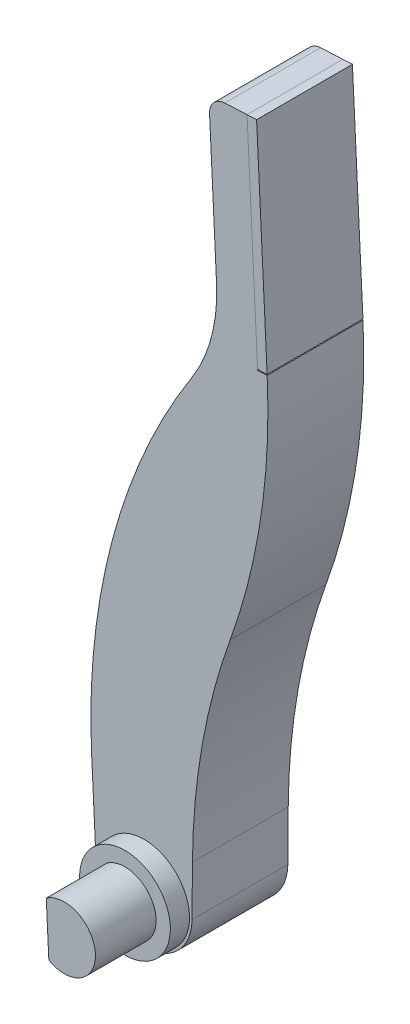
ISO-10303-21;
HEADER;
FILE_DESCRIPTION(('STEP AP214'),'2;1');
FILE_NAME('part.step','',(''),(''),'','','');
FILE_SCHEMA(('AUTOMOTIVE_DESIGN { 1 0 10303 214 1 1 1 1 }'));
ENDSEC;
DATA;
#1=APPLICATION_CONTEXT('core data for automotive mechanical design processes');
#2=APPLICATION_PROTOCOL_DEFINITION('international standard','automotive_design',2000,#1);
#3=PRODUCT_CONTEXT('',#1,'mechanical');
#4=PRODUCT('Part','Part','',(#3));
#5=PRODUCT_RELATED_PRODUCT_CATEGORY('part','',(#4));
#6=PRODUCT_DEFINITION_FORMATION('','',#4);
#7=PRODUCT_DEFINITION_CONTEXT('part definition',#1,'design');
#8=PRODUCT_DEFINITION('design','',#6,#7);
#9=PRODUCT_DEFINITION_SHAPE('','',#8);
#10=(LENGTH_UNIT() NAMED_UNIT(*) SI_UNIT(.MILLI.,.METRE.));
#11=(NAMED_UNIT(*) PLANE_ANGLE_UNIT() SI_UNIT($,.RADIAN.));
#12=(NAMED_UNIT(*) SI_UNIT($,.STERADIAN.) SOLID_ANGLE_UNIT());
#13=UNCERTAINTY_MEASURE_WITH_UNIT(LENGTH_MEASURE(1.E-05),#10,'distance_accuracy_value','');
#14=(GEOMETRIC_REPRESENTATION_CONTEXT(3) GLOBAL_UNCERTAINTY_ASSIGNED_CONTEXT((#13)) GLOBAL_UNIT_ASSIGNED_CONTEXT((#10,
#11,#12)) REPRESENTATION_CONTEXT('',''));
#15=CARTESIAN_POINT('',(0.,0.,0.));
#16=DIRECTION('',(0.,0.,1.));
#17=DIRECTION('',(1.,0.,0.));
#18=AXIS2_PLACEMENT_3D('',#15,#16,#17);
#19=CARTESIAN_POINT('',(-9.25002768605628,4.99999669799391,1.049983489967));
#20=DIRECTION('',(0.,0.,-1.));
#21=DIRECTION('',(-0.998810326232299,-0.0487640463018496,0.));
#22=AXIS2_PLACEMENT_3D('',#19,#20,#21);
#23=CYLINDRICAL_SURFACE('',#22,2.84233917081923);
#24=CARTESIAN_POINT('',(-9.25002768605628,4.99999669799391,-3.950016510033));
#25=DIRECTION('',(0.,0.,1.));
#26=DIRECTION('',(0.998810326232299,0.0487640463018496,0.));
#27=AXIS2_PLACEMENT_3D('',#24,#25,#26);
#28=CIRCLE('',#27,2.84233917081923);
#29=CARTESIAN_POINT('',(-6.41106997158749,5.1386006569253,-3.950016510033));
#30=VERTEX_POINT('',#29);
#31=EDGE_CURVE('P0_E152',#30,#30,#28,.T.);
#32=ORIENTED_EDGE('',*,*,#31,.T.);
#33=EDGE_LOOP('',(#32));
#34=FACE_BOUND('',#33,.T.);
#35=CARTESIAN_POINT('',(-9.25002768605628,4.99999669799391,-2.750016510033));
#36=DIRECTION('',(0.,0.,1.));
#37=DIRECTION('',(0.998810326232299,0.0487640463018496,0.));
#38=AXIS2_PLACEMENT_3D('',#35,#36,#37);
#39=CIRCLE('',#38,2.84233917081923);
#40=CARTESIAN_POINT('',(-6.41106997158749,5.1386006569253,-2.750016510033));
#41=VERTEX_POINT('',#40);
#42=EDGE_CURVE('P0_E138',#41,#41,#39,.T.);
#43=ORIENTED_EDGE('',*,*,#42,.F.);
#44=EDGE_LOOP('',(#43));
#45=FACE_BOUND('',#44,.T.);
#46=ADVANCED_FACE('P0_F16',(#34,#45),#23,.T.);
#47=CARTESIAN_POINT('',(-9.25002768605628,4.99999669799391,-3.950016510033));
#48=DIRECTION('',(0.,0.,-1.));
#49=DIRECTION('',(-0.998810326232299,-0.0487640463018496,0.));
#50=AXIS2_PLACEMENT_3D('',#47,#48,#49);
#51=CYLINDRICAL_SURFACE('',#50,1.5);
#52=CARTESIAN_POINT('',(-9.25002768605628,4.99999669799391,-3.950016510033));
#53=DIRECTION('',(0.,0.,1.));
#54=DIRECTION('',(0.998810326232299,0.0487640463018496,0.));
#55=AXIS2_PLACEMENT_3D('',#52,#53,#54);
#56=CIRCLE('',#55,1.5);
#57=CARTESIAN_POINT('',(-10.1943181510941,3.83452875864998,-3.950016510033));
#58=VERTEX_POINT('',#57);
#59=CARTESIAN_POINT('',(-10.303357873483,6.06793654473414,-3.950016510033));
#60=VERTEX_POINT('',#59);
#61=EDGE_CURVE('P0_E39',#58,#60,#56,.T.);
#62=ORIENTED_EDGE('',*,*,#61,.T.);
#63=DIRECTION('',(0.,0.,1.));
#64=VECTOR('',#63,1.);
#65=CARTESIAN_POINT('',(-10.303357873483,6.06793654473414,-10.7413043575109));
#66=LINE('',#65,#64);
#67=CARTESIAN_POINT('',(-10.303357873483,6.06793654473414,-8.450016510033));
#68=VERTEX_POINT('',#67);
#69=EDGE_CURVE('P0_E156',#68,#60,#66,.T.);
#70=ORIENTED_EDGE('',*,*,#69,.F.);
#71=CARTESIAN_POINT('',(-9.25002768605628,4.99999669799391,-8.450016510033));
#72=DIRECTION('',(0.,0.,-1.));
#73=DIRECTION('',(-0.998810326232299,-0.0487640463018496,0.));
#74=AXIS2_PLACEMENT_3D('',#71,#72,#73);
#75=CIRCLE('',#74,1.5);
#76=CARTESIAN_POINT('',(-10.1943181510941,3.83452875864998,-8.450016510033));
#77=VERTEX_POINT('',#76);
#78=EDGE_CURVE('P0_E20',#68,#77,#75,.T.);
#79=ORIENTED_EDGE('',*,*,#78,.T.);
#80=DIRECTION('',(0.,0.,1.));
#81=VECTOR('',#80,1.);
#82=CARTESIAN_POINT('',(-10.1943181510941,3.83452875864998,-10.7413043575109));
#83=LINE('',#82,#81);
#84=EDGE_CURVE('P0_E160',#77,#58,#83,.T.);
#85=ORIENTED_EDGE('',*,*,#84,.T.);
#86=EDGE_LOOP('',(#62,#70,#79,#85));
#87=FACE_BOUND('',#86,.T.);
#88=ADVANCED_FACE('P0_F328',(#87),#51,.F.);
#89=CARTESIAN_POINT('',(-11.4444097696395,49.9464613784474,-3.95001651003299));
#90=DIRECTION('',(-0.0487640463018496,0.998810326232299,0.));
#91=DIRECTION('',(0.,0.,1.));
#92=AXIS2_PLACEMENT_3D('',#89,#90,#91);
#93=PLANE('',#92);
#94=DIRECTION('',(0.998810326232299,0.0487640463018496,0.));
#95=VECTOR('',#94,1.);
#96=CARTESIAN_POINT('',(-11.4444097696395,49.9464613784474,-3.95001651003299));
#97=LINE('',#96,#95);
#98=CARTESIAN_POINT('',(-4.20303490445534,50.3000007141358,-3.95001651003299));
#99=VERTEX_POINT('',#98);
#100=CARTESIAN_POINT('',(-2.80470044773013,50.3682703789583,-3.95001651003299));
#101=VERTEX_POINT('',#100);
#102=EDGE_CURVE('P0_E197',#99,#101,#97,.T.);
#103=ORIENTED_EDGE('',*,*,#102,.T.);
#104=DIRECTION('',(0.,0.,1.));
#105=VECTOR('',#104,1.);
#106=CARTESIAN_POINT('',(-2.80470044773013,50.3682703789583,-9.950016510033));
#107=LINE('',#106,#105);
#108=CARTESIAN_POINT('',(-2.80470044773013,50.3682703789583,-9.950016510033));
#109=VERTEX_POINT('',#108);
#110=EDGE_CURVE('P0_E164',#109,#101,#107,.T.);
#111=ORIENTED_EDGE('',*,*,#110,.F.);
#112=DIRECTION('',(0.998810326232299,0.0487640463018496,0.));
#113=VECTOR('',#112,1.);
#114=CARTESIAN_POINT('',(-11.4444097696395,49.9464613784474,-9.95001651003299));
#115=LINE('',#114,#113);
#116=CARTESIAN_POINT('',(-4.20303490445534,50.3000007141358,-9.950016510033));
#117=VERTEX_POINT('',#116);
#118=EDGE_CURVE('P0_E213',#117,#109,#115,.T.);
#119=ORIENTED_EDGE('',*,*,#118,.F.);
#120=DIRECTION('',(0.,0.,-1.));
#121=VECTOR('',#120,1.);
#122=CARTESIAN_POINT('',(-4.20303490445534,50.3000007141358,-3.95001651003299));
#123=LINE('',#122,#121);
#124=EDGE_CURVE('P0_E25',#117,#99,#123,.F.);
#125=ORIENTED_EDGE('',*,*,#124,.T.);
#126=EDGE_LOOP('',(#103,#111,#119,#125));
#127=FACE_BOUND('',#126,.T.);
#128=ADVANCED_FACE('P0_F263',(#127),#93,.T.);
#129=CARTESIAN_POINT('',(-12.2464586647532,4.85370455908836,-3.950016510033));
#130=DIRECTION('',(-0.998810326232299,-0.0487640463018496,0.));
#131=DIRECTION('',(0.,0.,1.));
#132=AXIS2_PLACEMENT_3D('',#129,#130,#131);
#133=PLANE('',#132);
#134=DIRECTION('',(-0.0487640463018496,0.998810326232299,0.));
#135=VECTOR('',#134,1.);
#136=CARTESIAN_POINT('',(-12.2464586647532,4.85370455908836,-3.950016510033));
#137=LINE('',#136,#135);
#138=CARTESIAN_POINT('',(-12.2464586647532,4.85370455908836,-3.950016510033));
#139=VERTEX_POINT('',#138);
#140=CARTESIAN_POINT('',(-12.538983816999,10.8453554761856,-3.950016510033));
#141=VERTEX_POINT('',#140);
#142=EDGE_CURVE('P0_E188',#139,#141,#137,.T.);
#143=ORIENTED_EDGE('',*,*,#142,.T.);
#144=DIRECTION('',(0.,0.,-1.));
#145=VECTOR('',#144,1.);
#146=CARTESIAN_POINT('',(-12.538983816999,10.8453554761856,-9.950016510033));
#147=LINE('',#146,#145);
#148=CARTESIAN_POINT('',(-12.538983816999,10.8453554761856,-9.950016510033));
#149=VERTEX_POINT('',#148);
#150=EDGE_CURVE('P0_E229',#141,#149,#147,.T.);
#151=ORIENTED_EDGE('',*,*,#150,.T.);
#152=DIRECTION('',(-0.0487640463018496,0.998810326232299,0.));
#153=VECTOR('',#152,1.);
#154=CARTESIAN_POINT('',(-12.2464586647532,4.85370455908836,-9.950016510033));
#155=LINE('',#154,#153);
#156=CARTESIAN_POINT('',(-12.2464586647532,4.85370455908836,-9.950016510033));
#157=VERTEX_POINT('',#156);
#158=EDGE_CURVE('P0_E205',#157,#149,#155,.T.);
#159=ORIENTED_EDGE('',*,*,#158,.F.);
#160=DIRECTION('',(0.,0.,-1.));
#161=VECTOR('',#160,1.);
#162=CARTESIAN_POINT('',(-12.2464586647532,4.85370455908836,-3.950016510033));
#163=LINE('',#162,#161);
#164=EDGE_CURVE('P0_E220',#139,#157,#163,.T.);
#165=ORIENTED_EDGE('',*,*,#164,.F.);
#166=EDGE_LOOP('',(#143,#151,#159,#165));
#167=FACE_BOUND('',#166,.T.);
#168=ADVANCED_FACE('P0_F291',(#167),#133,.T.);
#169=CARTESIAN_POINT('',(-9.25002768605628,4.99999669799391,-3.950016510033));
#170=DIRECTION('',(0.,0.,-1.));
#171=DIRECTION('',(-0.998810326232299,-0.0487640463018496,0.));
#172=AXIS2_PLACEMENT_3D('',#169,#170,#171);
#173=CYLINDRICAL_SURFACE('',#172,3.);
#174=CARTESIAN_POINT('',(-9.25002768605628,4.99999669799391,-9.950016510033));
#175=DIRECTION('',(0.,0.,1.));
#176=DIRECTION('',(0.998810326232299,0.0487640463018496,0.));
#177=AXIS2_PLACEMENT_3D('',#174,#175,#176);
#178=CIRCLE('',#177,3.);
#179=CARTESIAN_POINT('',(-6.25011792390585,4.97672828690567,-9.950016510033));
#180=VERTEX_POINT('',#179);
#181=EDGE_CURVE('P0_E208',#157,#180,#178,.T.);
#182=ORIENTED_EDGE('',*,*,#181,.T.);
#183=DIRECTION('',(0.,0.,-1.));
#184=VECTOR('',#183,1.);
#185=CARTESIAN_POINT('',(-6.25011792390585,4.97672828690567,-3.950016510033));
#186=LINE('',#185,#184);
#187=CARTESIAN_POINT('',(-6.25011792390585,4.97672828690567,-3.950016510033));
#188=VERTEX_POINT('',#187);
#189=EDGE_CURVE('P0_E204',#188,#180,#186,.T.);
#190=ORIENTED_EDGE('',*,*,#189,.F.);
#191=CARTESIAN_POINT('',(-9.25002768605628,4.99999669799391,-3.950016510033));
#192=DIRECTION('',(0.,0.,1.));
#193=DIRECTION('',(0.998810326232299,0.0487640463018496,0.));
#194=AXIS2_PLACEMENT_3D('',#191,#192,#193);
#195=CIRCLE('',#194,3.);
#196=EDGE_CURVE('P0_E191',#139,#188,#195,.T.);
#197=ORIENTED_EDGE('',*,*,#196,.F.);
#198=ORIENTED_EDGE('',*,*,#164,.T.);
#199=EDGE_LOOP('',(#182,#190,#197,#198));
#200=FACE_BOUND('',#199,.T.);
#201=ADVANCED_FACE('P0_F297',(#200),#173,.T.);
#202=CARTESIAN_POINT('',(-6.25011792390585,4.97672828690567,-3.950016510033));
#203=DIRECTION('',(-0.999969920716809,0.00775613702941517,0.));
#204=DIRECTION('',(-0.00775613702941517,-0.999969920716809,0.));
#205=AXIS2_PLACEMENT_3D('',#202,#203,#204);
#206=PLANE('',#205);
#207=DIRECTION('',(0.00775613702941517,0.999969920716809,0.));
#208=VECTOR('',#207,1.);
#209=CARTESIAN_POINT('',(-6.25011792390585,4.97672828690567,-9.950016510033));
#210=LINE('',#209,#208);
#211=CARTESIAN_POINT('',(-6.22578623212553,8.11372287689344,-9.950016510033));
#212=VERTEX_POINT('',#211);
#213=EDGE_CURVE('P0_E210',#180,#212,#210,.T.);
#214=ORIENTED_EDGE('',*,*,#213,.T.);
#215=DIRECTION('',(0.,0.,1.));
#216=VECTOR('',#215,1.);
#217=CARTESIAN_POINT('',(-6.22578623212553,8.11372287689344,-3.950016510033));
#218=LINE('',#217,#216);
#219=CARTESIAN_POINT('',(-6.22578623212553,8.11372287689344,-3.950016510033));
#220=VERTEX_POINT('',#219);
#221=EDGE_CURVE('P0_E238',#212,#220,#218,.T.);
#222=ORIENTED_EDGE('',*,*,#221,.T.);
#223=DIRECTION('',(0.00775613702941517,0.999969920716809,0.));
#224=VECTOR('',#223,1.);
#225=CARTESIAN_POINT('',(-6.25011792390585,4.97672828690567,-3.950016510033));
#226=LINE('',#225,#224);
#227=EDGE_CURVE('P0_E194',#188,#220,#226,.T.);
#228=ORIENTED_EDGE('',*,*,#227,.F.);
#229=ORIENTED_EDGE('',*,*,#189,.T.);
#230=EDGE_LOOP('',(#214,#222,#228,#229));
#231=FACE_BOUND('',#230,.T.);
#232=ADVANCED_FACE('P0_F316',(#231),#206,.F.);
#233=CARTESIAN_POINT('',(-3.00746314710441,5.30477198738047,-3.950016510033));
#234=DIRECTION('',(-0.998810326232299,-0.0487640463018495,0.));
#235=DIRECTION('',(0.0487640463018495,-0.998810326232299,0.));
#236=AXIS2_PLACEMENT_3D('',#233,#234,#235);
#237=PLANE('',#236);
#238=DIRECTION('',(-0.0487640463018495,0.998810326232299,0.));
#239=VECTOR('',#238,1.);
#240=CARTESIAN_POINT('',(-3.00746314710441,5.30477198738047,-3.950016510033));
#241=LINE('',#240,#239);
#242=CARTESIAN_POINT('',(-4.71283134476729,40.2350022498605,-3.950016510033));
#243=VERTEX_POINT('',#242);
#244=CARTESIAN_POINT('',(-5.15308118438579,49.2524263416016,-3.95001651003299));
#245=VERTEX_POINT('',#244);
#246=EDGE_CURVE('P0_E200',#243,#245,#241,.T.);
#247=ORIENTED_EDGE('',*,*,#246,.T.);
#248=DIRECTION('',(0.,0.,-1.));
#249=VECTOR('',#248,1.);
#250=CARTESIAN_POINT('',(-5.15308118438579,49.2524263416016,-3.95001651003299));
#251=LINE('',#250,#249);
#252=CARTESIAN_POINT('',(-5.15308118438579,49.2524263416016,-9.950016510033));
#253=VERTEX_POINT('',#252);
#254=EDGE_CURVE('P0_E254',#245,#253,#251,.T.);
#255=ORIENTED_EDGE('',*,*,#254,.T.);
#256=DIRECTION('',(-0.0487640463018495,0.998810326232299,0.));
#257=VECTOR('',#256,1.);
#258=CARTESIAN_POINT('',(-3.00746314710441,5.30477198738047,-9.950016510033));
#259=LINE('',#258,#257);
#260=CARTESIAN_POINT('',(-4.71283134476729,40.2350022498605,-9.950016510033));
#261=VERTEX_POINT('',#260);
#262=EDGE_CURVE('P0_E192',#261,#253,#259,.T.);
#263=ORIENTED_EDGE('',*,*,#262,.F.);
#264=DIRECTION('',(0.,0.,-1.));
#265=VECTOR('',#264,1.);
#266=CARTESIAN_POINT('',(-4.71283134476729,40.2350022498605,-3.950016510033));
#267=LINE('',#266,#265);
#268=EDGE_CURVE('P0_E222',#261,#243,#267,.F.);
#269=ORIENTED_EDGE('',*,*,#268,.T.);
#270=EDGE_LOOP('',(#247,#255,#263,#269));
#271=FACE_BOUND('',#270,.T.);
#272=ADVANCED_FACE('P0_F275',(#271),#237,.T.);
#273=CARTESIAN_POINT('',(-9.25002768605628,4.99999669799391,-3.950016510033));
#274=DIRECTION('',(0.,0.,1.));
#275=DIRECTION('',(0.998810326232299,0.0487640463018496,0.));
#276=AXIS2_PLACEMENT_3D('',#273,#274,#275);
#277=PLANE('',#276);
#278=ORIENTED_EDGE('',*,*,#31,.F.);
#279=EDGE_LOOP('',(#278));
#280=FACE_BOUND('',#279,.T.);
#281=DIRECTION('',(0.998810326232299,0.0487640463018496,0.));
#282=VECTOR('',#281,1.);
#283=CARTESIAN_POINT('',(-2.14353788476466,36.8259980433036,-3.950016510033));
#284=LINE('',#283,#282);
#285=CARTESIAN_POINT('',(-2.14353788476466,36.8259980433036,-3.950016510033));
#286=VERTEX_POINT('',#285);
#287=CARTESIAN_POINT('',(-1.54425168902528,36.8552564710847,-3.950016510033));
#288=VERTEX_POINT('',#287);
#289=EDGE_CURVE('P0_E177',#286,#288,#284,.T.);
#290=ORIENTED_EDGE('',*,*,#289,.F.);
#291=DIRECTION('',(0.0487640463018497,-0.998810326232299,0.));
#292=VECTOR('',#291,1.);
#293=CARTESIAN_POINT('',(-2.80470044773013,50.3682703789583,-3.95001651003299));
#294=LINE('',#293,#292);
#295=EDGE_CURVE('P0_E169',#101,#286,#294,.T.);
#296=ORIENTED_EDGE('',*,*,#295,.F.);
#297=ORIENTED_EDGE('',*,*,#102,.F.);
#298=CARTESIAN_POINT('',(-4.1542708581535,49.3011903879035,-3.95001651003299));
#299=DIRECTION('',(0.,0.,1.));
#300=DIRECTION('',(0.998810326232299,0.0487640463018496,0.));
#301=AXIS2_PLACEMENT_3D('',#298,#299,#300);
#302=CIRCLE('',#301,1.);
#303=EDGE_CURVE('P0_E11',#99,#245,#302,.T.);
#304=ORIENTED_EDGE('',*,*,#303,.T.);
#305=ORIENTED_EDGE('',*,*,#246,.F.);
#306=CARTESIAN_POINT('',(-14.7009346070903,39.747361786842,-3.95001651003299));
#307=DIRECTION('',(0.,0.,1.));
#308=DIRECTION('',(0.998810326232299,0.0487640463018496,0.));
#309=AXIS2_PLACEMENT_3D('',#306,#307,#308);
#310=CIRCLE('',#309,10.);
#311=CARTESIAN_POINT('',(-6.27806183921364,34.3570728951256,-3.950016510033));
#312=VERTEX_POINT('',#311);
#313=EDGE_CURVE('P0_E226',#243,#312,#310,.F.);
#314=ORIENTED_EDGE('',*,*,#313,.T.);
#315=CARTESIAN_POINT('',(27.4134292322929,12.7959173282596,-3.950016510033));
#316=DIRECTION('',(0.,0.,1.));
#317=DIRECTION('',(0.998810326232299,0.0487640463018496,0.));
#318=AXIS2_PLACEMENT_3D('',#315,#316,#317);
#319=CIRCLE('',#318,40.);
#320=EDGE_CURVE('P0_E236',#312,#141,#319,.T.);
#321=ORIENTED_EDGE('',*,*,#320,.T.);
#322=ORIENTED_EDGE('',*,*,#142,.F.);
#323=ORIENTED_EDGE('',*,*,#196,.T.);
#324=ORIENTED_EDGE('',*,*,#227,.T.);
#325=CARTESIAN_POINT('',(33.7730105965468,7.80347739571683,-3.950016510033));
#326=DIRECTION('',(0.,0.,1.));
#327=DIRECTION('',(0.998810326232299,0.0487640463018496,0.));
#328=AXIS2_PLACEMENT_3D('',#325,#326,#327);
#329=CIRCLE('',#328,40.);
#330=CARTESIAN_POINT('',(-3.86182707088521,21.3540860073638,-3.950016510033));
#331=VERTEX_POINT('',#330);
#332=EDGE_CURVE('P0_E242',#220,#331,#329,.F.);
#333=ORIENTED_EDGE('',*,*,#332,.T.);
#334=CARTESIAN_POINT('',(-41.4966647383172,34.9046946190107,-3.95001651003299));
#335=DIRECTION('',(0.,0.,1.));
#336=DIRECTION('',(0.998810326232299,0.0487640463018496,0.));
#337=AXIS2_PLACEMENT_3D('',#334,#335,#336);
#338=CIRCLE('',#337,40.);
#339=EDGE_CURVE('P0_E251',#331,#288,#338,.T.);
#340=ORIENTED_EDGE('',*,*,#339,.T.);
#341=EDGE_LOOP('',(#290,#296,#297,#304,#305,#314,#321,#322,#323,#324,#333,#340));
#342=FACE_BOUND('',#341,.T.);
#343=ADVANCED_FACE('P0_F270',(#280,#342),#277,.T.);
#344=CARTESIAN_POINT('',(-9.25002768605628,4.99999669799391,-9.950016510033));
#345=DIRECTION('',(0.,0.,1.));
#346=DIRECTION('',(0.998810326232299,0.0487640463018496,0.));
#347=AXIS2_PLACEMENT_3D('',#344,#345,#346);
#348=PLANE('',#347);
#349=CARTESIAN_POINT('',(-9.25002768605628,4.99999669799391,-9.950016510033));
#350=DIRECTION('',(0.,0.,-1.));
#351=DIRECTION('',(-0.998810326232299,-0.0487640463018496,0.));
#352=AXIS2_PLACEMENT_3D('',#349,#350,#351);
#353=CIRCLE('',#352,2.1);
#354=CARTESIAN_POINT('',(-11.3475293711441,4.89759220076003,-9.950016510033));
#355=VERTEX_POINT('',#354);
#356=EDGE_CURVE('P0_E181',#355,#355,#353,.T.);
#357=ORIENTED_EDGE('',*,*,#356,.F.);
#358=EDGE_LOOP('',(#357));
#359=FACE_BOUND('',#358,.T.);
#360=DIRECTION('',(-0.0487640463018497,0.998810326232299,0.));
#361=VECTOR('',#360,1.);
#362=CARTESIAN_POINT('',(-2.14353788476466,36.8259980433036,-9.950016510033));
#363=LINE('',#362,#361);
#364=CARTESIAN_POINT('',(-2.14353788476466,36.8259980433036,-9.950016510033));
#365=VERTEX_POINT('',#364);
#366=EDGE_CURVE('P0_E175',#365,#109,#363,.T.);
#367=ORIENTED_EDGE('',*,*,#366,.F.);
#368=DIRECTION('',(0.998810326232299,0.0487640463018496,0.));
#369=VECTOR('',#368,1.);
#370=CARTESIAN_POINT('',(-2.14353788476466,36.8259980433036,-9.950016510033));
#371=LINE('',#370,#369);
#372=CARTESIAN_POINT('',(-1.54425168902528,36.8552564710847,-9.950016510033));
#373=VERTEX_POINT('',#372);
#374=EDGE_CURVE('P0_E178',#365,#373,#371,.T.);
#375=ORIENTED_EDGE('',*,*,#374,.T.);
#376=CARTESIAN_POINT('',(-41.4966647383172,34.9046946190107,-9.95001651003299));
#377=DIRECTION('',(0.,0.,1.));
#378=DIRECTION('',(0.998810326232299,0.0487640463018496,0.));
#379=AXIS2_PLACEMENT_3D('',#376,#377,#378);
#380=CIRCLE('',#379,40.);
#381=CARTESIAN_POINT('',(-3.86182707088521,21.3540860073638,-9.950016510033));
#382=VERTEX_POINT('',#381);
#383=EDGE_CURVE('P0_E247',#373,#382,#380,.F.);
#384=ORIENTED_EDGE('',*,*,#383,.T.);
#385=CARTESIAN_POINT('',(33.7730105965468,7.80347739571683,-9.950016510033));
#386=DIRECTION('',(0.,0.,1.));
#387=DIRECTION('',(0.998810326232299,0.0487640463018496,0.));
#388=AXIS2_PLACEMENT_3D('',#385,#386,#387);
#389=CIRCLE('',#388,40.);
#390=EDGE_CURVE('P0_E240',#382,#212,#389,.T.);
#391=ORIENTED_EDGE('',*,*,#390,.T.);
#392=ORIENTED_EDGE('',*,*,#213,.F.);
#393=ORIENTED_EDGE('',*,*,#181,.F.);
#394=ORIENTED_EDGE('',*,*,#158,.T.);
#395=CARTESIAN_POINT('',(27.4134292322929,12.7959173282596,-9.950016510033));
#396=DIRECTION('',(0.,0.,1.));
#397=DIRECTION('',(0.998810326232299,0.0487640463018496,0.));
#398=AXIS2_PLACEMENT_3D('',#395,#396,#397);
#399=CIRCLE('',#398,40.);
#400=CARTESIAN_POINT('',(-6.27806183921364,34.3570728951256,-9.950016510033));
#401=VERTEX_POINT('',#400);
#402=EDGE_CURVE('P0_E232',#149,#401,#399,.F.);
#403=ORIENTED_EDGE('',*,*,#402,.T.);
#404=CARTESIAN_POINT('',(-14.7009346070903,39.747361786842,-9.950016510033));
#405=DIRECTION('',(0.,0.,1.));
#406=DIRECTION('',(0.998810326232299,0.0487640463018496,0.));
#407=AXIS2_PLACEMENT_3D('',#404,#405,#406);
#408=CIRCLE('',#407,10.);
#409=EDGE_CURVE('P0_E224',#401,#261,#408,.T.);
#410=ORIENTED_EDGE('',*,*,#409,.T.);
#411=ORIENTED_EDGE('',*,*,#262,.T.);
#412=CARTESIAN_POINT('',(-4.1542708581535,49.3011903879035,-9.950016510033));
#413=DIRECTION('',(0.,0.,1.));
#414=DIRECTION('',(0.998810326232299,0.0487640463018496,0.));
#415=AXIS2_PLACEMENT_3D('',#412,#413,#414);
#416=CIRCLE('',#415,1.);
#417=EDGE_CURVE('P0_E257',#253,#117,#416,.F.);
#418=ORIENTED_EDGE('',*,*,#417,.T.);
#419=ORIENTED_EDGE('',*,*,#118,.T.);
#420=EDGE_LOOP('',(#367,#375,#384,#391,#392,#393,#394,#403,#410,#411,#418,#419));
#421=FACE_BOUND('',#420,.T.);
#422=ADVANCED_FACE('P0_F279',(#359,#421),#348,.F.);
#423=CARTESIAN_POINT('',(-14.7009346070903,39.747361786842,-3.95001651003299));
#424=DIRECTION('',(0.,0.,1.));
#425=DIRECTION('',(0.998810326232299,0.0487640463018496,0.));
#426=AXIS2_PLACEMENT_3D('',#423,#424,#425);
#427=CYLINDRICAL_SURFACE('',#426,10.);
#428=ORIENTED_EDGE('',*,*,#409,.F.);
#429=DIRECTION('',(0.,0.,1.));
#430=VECTOR('',#429,1.);
#431=CARTESIAN_POINT('',(-6.27806183921364,34.3570728951256,-3.950016510033));
#432=LINE('',#431,#430);
#433=EDGE_CURVE('P0_E234',#401,#312,#432,.T.);
#434=ORIENTED_EDGE('',*,*,#433,.T.);
#435=ORIENTED_EDGE('',*,*,#313,.F.);
#436=ORIENTED_EDGE('',*,*,#268,.F.);
#437=EDGE_LOOP('',(#428,#434,#435,#436));
#438=FACE_BOUND('',#437,.T.);
#439=ADVANCED_FACE('P0_F283',(#438),#427,.F.);
#440=CARTESIAN_POINT('',(27.4134292322929,12.7959173282596,-3.950016510033));
#441=DIRECTION('',(0.,0.,1.));
#442=DIRECTION('',(0.998810326232299,0.0487640463018496,0.));
#443=AXIS2_PLACEMENT_3D('',#440,#441,#442);
#444=CYLINDRICAL_SURFACE('',#443,40.);
#445=ORIENTED_EDGE('',*,*,#320,.F.);
#446=ORIENTED_EDGE('',*,*,#433,.F.);
#447=ORIENTED_EDGE('',*,*,#402,.F.);
#448=ORIENTED_EDGE('',*,*,#150,.F.);
#449=EDGE_LOOP('',(#445,#446,#447,#448));
#450=FACE_BOUND('',#449,.T.);
#451=ADVANCED_FACE('P0_F287',(#450),#444,.T.);
#452=CARTESIAN_POINT('',(33.7730105965468,7.80347739571683,-3.950016510033));
#453=DIRECTION('',(0.,0.,1.));
#454=DIRECTION('',(0.998810326232299,0.0487640463018496,0.));
#455=AXIS2_PLACEMENT_3D('',#452,#453,#454);
#456=CYLINDRICAL_SURFACE('',#455,40.);
#457=ORIENTED_EDGE('',*,*,#390,.F.);
#458=DIRECTION('',(0.,0.,1.));
#459=VECTOR('',#458,1.);
#460=CARTESIAN_POINT('',(-3.86182707088522,21.3540860073638,-3.950016510033));
#461=LINE('',#460,#459);
#462=EDGE_CURVE('P0_E249',#382,#331,#461,.T.);
#463=ORIENTED_EDGE('',*,*,#462,.T.);
#464=ORIENTED_EDGE('',*,*,#332,.F.);
#465=ORIENTED_EDGE('',*,*,#221,.F.);
#466=EDGE_LOOP('',(#457,#463,#464,#465));
#467=FACE_BOUND('',#466,.T.);
#468=ADVANCED_FACE('P0_F305',(#467),#456,.F.);
#469=CARTESIAN_POINT('',(-41.4966647383172,34.9046946190107,-3.95001651003299));
#470=DIRECTION('',(0.,0.,1.));
#471=DIRECTION('',(0.998810326232299,0.0487640463018496,0.));
#472=AXIS2_PLACEMENT_3D('',#469,#470,#471);
#473=CYLINDRICAL_SURFACE('',#472,40.);
#474=ORIENTED_EDGE('',*,*,#339,.F.);
#475=ORIENTED_EDGE('',*,*,#462,.F.);
#476=ORIENTED_EDGE('',*,*,#383,.F.);
#477=DIRECTION('',(0.,0.,-1.));
#478=VECTOR('',#477,1.);
#479=CARTESIAN_POINT('',(-1.54425168902528,36.8552564710847,-9.950016510033));
#480=LINE('',#479,#478);
#481=EDGE_CURVE('P0_E245',#288,#373,#480,.T.);
#482=ORIENTED_EDGE('',*,*,#481,.F.);
#483=EDGE_LOOP('',(#474,#475,#476,#482));
#484=FACE_BOUND('',#483,.T.);
#485=ADVANCED_FACE('P0_F309',(#484),#473,.T.);
#486=CARTESIAN_POINT('',(-4.1542708581535,49.3011903879035,-3.95001651003299));
#487=DIRECTION('',(0.,0.,-1.));
#488=DIRECTION('',(-0.998810326232299,-0.0487640463018496,0.));
#489=AXIS2_PLACEMENT_3D('',#486,#487,#488);
#490=CYLINDRICAL_SURFACE('',#489,1.);
#491=ORIENTED_EDGE('',*,*,#303,.F.);
#492=ORIENTED_EDGE('',*,*,#124,.F.);
#493=ORIENTED_EDGE('',*,*,#417,.F.);
#494=ORIENTED_EDGE('',*,*,#254,.F.);
#495=EDGE_LOOP('',(#491,#492,#493,#494));
#496=FACE_BOUND('',#495,.T.);
#497=ADVANCED_FACE('P0_F18',(#496),#490,.T.);
#498=CARTESIAN_POINT('',(-9.25002768605628,4.99999669799391,-8.450016510033));
#499=DIRECTION('',(0.,0.,-1.));
#500=DIRECTION('',(-0.998810326232299,-0.0487640463018496,0.));
#501=AXIS2_PLACEMENT_3D('',#498,#499,#500);
#502=CYLINDRICAL_SURFACE('',#501,2.1);
#503=CARTESIAN_POINT('',(-9.25002768605628,4.99999669799391,-8.450016510033));
#504=DIRECTION('',(0.,0.,-1.));
#505=DIRECTION('',(-0.998810326232299,-0.0487640463018496,0.));
#506=AXIS2_PLACEMENT_3D('',#503,#504,#505);
#507=CIRCLE('',#506,2.1);
#508=CARTESIAN_POINT('',(-11.3475293711441,4.89759220076003,-8.450016510033));
#509=VERTEX_POINT('',#508);
#510=EDGE_CURVE('P0_E183',#509,#509,#507,.T.);
#511=ORIENTED_EDGE('',*,*,#510,.F.);
#512=EDGE_LOOP('',(#511));
#513=FACE_BOUND('',#512,.T.);
#514=ORIENTED_EDGE('',*,*,#356,.T.);
#515=EDGE_LOOP('',(#514));
#516=FACE_BOUND('',#515,.T.);
#517=ADVANCED_FACE('P0_F352',(#513,#516),#502,.F.);
#518=CARTESIAN_POINT('',(-9.25002768605628,4.99999669799391,-8.450016510033));
#519=DIRECTION('',(0.,0.,-1.));
#520=DIRECTION('',(-0.998810326232299,-0.0487640463018496,0.));
#521=AXIS2_PLACEMENT_3D('',#518,#519,#520);
#522=PLANE('',#521);
#523=ORIENTED_EDGE('',*,*,#78,.F.);
#524=DIRECTION('',(0.0487640463018496,-0.998810326232299,0.));
#525=VECTOR('',#524,1.);
#526=CARTESIAN_POINT('',(-10.2488380122886,4.95123265169206,-8.450016510033));
#527=LINE('',#526,#525);
#528=EDGE_CURVE('P0_E161',#68,#77,#527,.T.);
#529=ORIENTED_EDGE('',*,*,#528,.T.);
#530=EDGE_LOOP('',(#523,#529));
#531=FACE_BOUND('',#530,.T.);
#532=ORIENTED_EDGE('',*,*,#510,.T.);
#533=EDGE_LOOP('',(#532));
#534=FACE_BOUND('',#533,.T.);
#535=ADVANCED_FACE('P0_F349',(#531,#534),#522,.T.);
#536=CARTESIAN_POINT('',(-2.14353788476466,36.8259980433036,-3.950016510033));
#537=DIRECTION('',(0.0487640463018496,-0.998810326232299,0.));
#538=DIRECTION('',(0.998810326232299,0.0487640463018496,0.));
#539=AXIS2_PLACEMENT_3D('',#536,#537,#538);
#540=PLANE('',#539);
#541=ORIENTED_EDGE('',*,*,#481,.T.);
#542=ORIENTED_EDGE('',*,*,#374,.F.);
#543=DIRECTION('',(0.,0.,-1.));
#544=VECTOR('',#543,1.);
#545=CARTESIAN_POINT('',(-2.14353788476466,36.8259980433036,-3.950016510033));
#546=LINE('',#545,#544);
#547=EDGE_CURVE('P0_E172',#286,#365,#546,.T.);
#548=ORIENTED_EDGE('',*,*,#547,.F.);
#549=ORIENTED_EDGE('',*,*,#289,.T.);
#550=EDGE_LOOP('',(#541,#542,#548,#549));
#551=FACE_BOUND('',#550,.T.);
#552=ADVANCED_FACE('P0_F312',(#551),#540,.F.);
#553=CARTESIAN_POINT('',(-0.610318364146894,5.42180569850491,-9.950016510033));
#554=DIRECTION('',(0.998810326232299,0.0487640463018497,0.));
#555=DIRECTION('',(-0.0487640463018497,0.998810326232299,0.));
#556=AXIS2_PLACEMENT_3D('',#553,#554,#555);
#557=PLANE('',#556);
#558=ORIENTED_EDGE('',*,*,#110,.T.);
#559=ORIENTED_EDGE('',*,*,#295,.T.);
#560=ORIENTED_EDGE('',*,*,#547,.T.);
#561=ORIENTED_EDGE('',*,*,#366,.T.);
#562=EDGE_LOOP('',(#558,#559,#560,#561));
#563=FACE_BOUND('',#562,.T.);
#564=ADVANCED_FACE('P0_F314',(#563),#557,.T.);
#565=CARTESIAN_POINT('',(-10.2488380122886,4.95123265169206,-10.7413043575109));
#566=DIRECTION('',(-0.998810326232299,-0.0487640463018496,0.));
#567=DIRECTION('',(0.,0.,1.));
#568=AXIS2_PLACEMENT_3D('',#565,#566,#567);
#569=PLANE('',#568);
#570=ORIENTED_EDGE('',*,*,#528,.F.);
#571=ORIENTED_EDGE('',*,*,#69,.T.);
#572=DIRECTION('',(0.0487640463018496,-0.998810326232299,0.));
#573=VECTOR('',#572,1.);
#574=CARTESIAN_POINT('',(-10.2488380122886,4.95123265169206,-3.950016510033));
#575=LINE('',#574,#573);
#576=EDGE_CURVE('P0_E157',#60,#58,#575,.T.);
#577=ORIENTED_EDGE('',*,*,#576,.T.);
#578=ORIENTED_EDGE('',*,*,#84,.F.);
#579=EDGE_LOOP('',(#570,#571,#577,#578));
#580=FACE_BOUND('',#579,.T.);
#581=ADVANCED_FACE('P0_F341',(#580),#569,.F.);
#582=CARTESIAN_POINT('',(-9.25002768605628,4.99999669799391,-3.950016510033));
#583=DIRECTION('',(0.,0.,1.));
#584=DIRECTION('',(0.998810326232299,0.0487640463018496,0.));
#585=AXIS2_PLACEMENT_3D('',#582,#583,#584);
#586=PLANE('',#585);
#587=ORIENTED_EDGE('',*,*,#61,.F.);
#588=ORIENTED_EDGE('',*,*,#576,.F.);
#589=EDGE_LOOP('',(#587,#588));
#590=FACE_BOUND('',#589,.T.);
#591=ADVANCED_FACE('P0_F339',(#590),#586,.F.);
#592=CARTESIAN_POINT('',(-9.25002768605628,4.99999669799391,-2.750016510033));
#593=DIRECTION('',(0.,0.,1.));
#594=DIRECTION('',(0.998810326232299,0.0487640463018496,0.));
#595=AXIS2_PLACEMENT_3D('',#592,#593,#594);
#596=CYLINDRICAL_SURFACE('',#595,1.95);
#597=CARTESIAN_POINT('',(-9.25002768605628,4.99999669799391,1.049983489967));
#598=DIRECTION('',(0.,0.,1.));
#599=DIRECTION('',(0.998810326232299,0.0487640463018496,0.));
#600=AXIS2_PLACEMENT_3D('',#597,#598,#599);
#601=CIRCLE('',#600,1.95);
#602=CARTESIAN_POINT('',(-10.2186510241359,3.3075816103374,1.049983489967));
#603=VERTEX_POINT('',#602);
#604=CARTESIAN_POINT('',(-10.3789060330644,6.59000728841654,1.049983489967));
#605=VERTEX_POINT('',#604);
#606=EDGE_CURVE('P0_E32',#603,#605,#601,.T.);
#607=ORIENTED_EDGE('',*,*,#606,.F.);
#608=DIRECTION('',(0.,0.,1.));
#609=VECTOR('',#608,1.);
#610=CARTESIAN_POINT('',(-10.2186510241359,3.3075816103374,-2.750016510033));
#611=LINE('',#610,#609);
#612=CARTESIAN_POINT('',(-10.2186510241359,3.3075816103374,-2.750016510033));
#613=VERTEX_POINT('',#612);
#614=EDGE_CURVE('P0_E132',#613,#603,#611,.T.);
#615=ORIENTED_EDGE('',*,*,#614,.F.);
#616=CARTESIAN_POINT('',(-9.25002768605628,4.99999669799391,-2.750016510033));
#617=DIRECTION('',(0.,0.,1.));
#618=DIRECTION('',(0.998810326232299,0.0487640463018496,0.));
#619=AXIS2_PLACEMENT_3D('',#616,#617,#618);
#620=CIRCLE('',#619,1.95);
#621=CARTESIAN_POINT('',(-10.3789060330644,6.59000728841654,-2.750016510033));
#622=VERTEX_POINT('',#621);
#623=EDGE_CURVE('P0_E139',#613,#622,#620,.T.);
#624=ORIENTED_EDGE('',*,*,#623,.T.);
#625=DIRECTION('',(0.,0.,1.));
#626=VECTOR('',#625,1.);
#627=CARTESIAN_POINT('',(-10.3789060330644,6.59000728841654,-2.750016510033));
#628=LINE('',#627,#626);
#629=EDGE_CURVE('P0_E134',#622,#605,#628,.T.);
#630=ORIENTED_EDGE('',*,*,#629,.T.);
#631=EDGE_LOOP('',(#607,#615,#624,#630));
#632=FACE_BOUND('',#631,.T.);
#633=ADVANCED_FACE('P0_F141',(#632),#596,.T.);
#634=CARTESIAN_POINT('',(-10.2987785286002,4.94879444937697,-2.750016510033));
#635=DIRECTION('',(-0.998810326232299,-0.0487640463018496,0.));
#636=DIRECTION('',(0.,0.,1.));
#637=AXIS2_PLACEMENT_3D('',#634,#635,#636);
#638=PLANE('',#637);
#639=DIRECTION('',(0.0487640463018496,-0.998810326232299,0.));
#640=VECTOR('',#639,1.);
#641=CARTESIAN_POINT('',(-10.2987785286002,4.94879444937697,1.049983489967));
#642=LINE('',#641,#640);
#643=EDGE_CURVE('P0_E145',#605,#603,#642,.T.);
#644=ORIENTED_EDGE('',*,*,#643,.F.);
#645=ORIENTED_EDGE('',*,*,#629,.F.);
#646=DIRECTION('',(0.0487640463018496,-0.998810326232299,0.));
#647=VECTOR('',#646,1.);
#648=CARTESIAN_POINT('',(-10.2987785286002,4.94879444937697,-2.750016510033));
#649=LINE('',#648,#647);
#650=EDGE_CURVE('P0_E130',#622,#613,#649,.T.);
#651=ORIENTED_EDGE('',*,*,#650,.T.);
#652=ORIENTED_EDGE('',*,*,#614,.T.);
#653=EDGE_LOOP('',(#644,#645,#651,#652));
#654=FACE_BOUND('',#653,.T.);
#655=ADVANCED_FACE('P0_F131',(#654),#638,.T.);
#656=CARTESIAN_POINT('',(-9.25002768605628,4.99999669799391,-2.750016510033));
#657=DIRECTION('',(0.,0.,1.));
#658=DIRECTION('',(0.998810326232299,0.0487640463018496,0.));
#659=AXIS2_PLACEMENT_3D('',#656,#657,#658);
#660=PLANE('',#659);
#661=ORIENTED_EDGE('',*,*,#623,.F.);
#662=ORIENTED_EDGE('',*,*,#650,.F.);
#663=EDGE_LOOP('',(#661,#662));
#664=FACE_BOUND('',#663,.T.);
#665=ORIENTED_EDGE('',*,*,#42,.T.);
#666=EDGE_LOOP('',(#665));
#667=FACE_BOUND('',#666,.T.);
#668=ADVANCED_FACE('P0_F143',(#664,#667),#660,.T.);
#669=CARTESIAN_POINT('',(-9.25002768605628,4.99999669799391,1.049983489967));
#670=DIRECTION('',(0.,0.,1.));
#671=DIRECTION('',(0.998810326232299,0.0487640463018496,0.));
#672=AXIS2_PLACEMENT_3D('',#669,#670,#671);
#673=PLANE('',#672);
#674=ORIENTED_EDGE('',*,*,#643,.T.);
#675=ORIENTED_EDGE('',*,*,#606,.T.);
#676=EDGE_LOOP('',(#674,#675));
#677=FACE_BOUND('',#676,.T.);
#678=ADVANCED_FACE('P0_F426',(#677),#673,.T.);
#679=CLOSED_SHELL('',(#46,#88,#128,#168,#201,#232,#272,#343,#422,#439,#451,#468,#485,#497,#517,
#535,#552,#564,#581,#591,#633,#655,#668,#678));
#680=MANIFOLD_SOLID_BREP('P0_B1',#679);
#681=CARTESIAN_POINT('',(-2.20541425199075,50.3975288067395,-9.95001651003299));
#682=DIRECTION('',(0.0487640463018508,-0.998810326232299,0.));
#683=DIRECTION('',(0.,0.,-1.));
#684=AXIS2_PLACEMENT_3D('',#681,#682,#683);
#685=PLANE('',#684);
#686=DIRECTION('',(0.,0.,1.));
#687=VECTOR('',#686,1.);
#688=CARTESIAN_POINT('',(-2.80470044773013,50.3682703789584,-9.95001651003299));
#689=LINE('',#688,#687);
#690=CARTESIAN_POINT('',(-2.80470044773013,50.3682703789584,-9.95001651003299));
#691=VERTEX_POINT('',#690);
#692=CARTESIAN_POINT('',(-2.80470044773013,50.3682703789584,-3.95001651003299));
#693=VERTEX_POINT('',#692);
#694=EDGE_CURVE('P1_E79',#691,#693,#689,.T.);
#695=ORIENTED_EDGE('',*,*,#694,.T.);
#696=DIRECTION('',(-0.998810326232299,-0.0487640463018508,0.));
#697=VECTOR('',#696,1.);
#698=CARTESIAN_POINT('',(-2.20541425199075,50.3975288067395,-3.95001651003299));
#699=LINE('',#698,#697);
#700=CARTESIAN_POINT('',(-2.20541425199075,50.3975288067395,-3.95001651003299));
#701=VERTEX_POINT('',#700);
#702=EDGE_CURVE('P1_E11',#701,#693,#699,.T.);
#703=ORIENTED_EDGE('',*,*,#702,.F.);
#704=DIRECTION('',(0.,0.,1.));
#705=VECTOR('',#704,1.);
#706=CARTESIAN_POINT('',(-2.20541425199075,50.3975288067395,-9.95001651003299));
#707=LINE('',#706,#705);
#708=CARTESIAN_POINT('',(-2.20541425199075,50.3975288067395,-9.95001651003299));
#709=VERTEX_POINT('',#708);
#710=EDGE_CURVE('P1_E67',#709,#701,#707,.T.);
#711=ORIENTED_EDGE('',*,*,#710,.F.);
#712=DIRECTION('',(-0.998810326232299,-0.0487640463018508,0.));
#713=VECTOR('',#712,1.);
#714=CARTESIAN_POINT('',(-2.20541425199075,50.3975288067395,-9.95001651003299));
#715=LINE('',#714,#713);
#716=EDGE_CURVE('P1_E75',#709,#691,#715,.T.);
#717=ORIENTED_EDGE('',*,*,#716,.T.);
#718=EDGE_LOOP('',(#695,#703,#711,#717));
#719=FACE_BOUND('',#718,.T.);
#720=ADVANCED_FACE('P1_F16',(#719),#685,.F.);
#721=CARTESIAN_POINT('',(-2.20541425199075,50.3975288067395,-3.95001651003299));
#722=DIRECTION('',(0.,0.,-1.));
#723=DIRECTION('',(0.998810326232299,0.0487640463018508,0.));
#724=AXIS2_PLACEMENT_3D('',#721,#722,#723);
#725=PLANE('',#724);
#726=DIRECTION('',(0.0487640463018508,-0.998810326232299,0.));
#727=VECTOR('',#726,1.);
#728=CARTESIAN_POINT('',(-2.80470044773013,50.3682703789584,-3.95001651003299));
#729=LINE('',#728,#727);
#730=CARTESIAN_POINT('',(-2.14638582265514,36.8843309748223,-3.95001651003299));
#731=VERTEX_POINT('',#730);
#732=EDGE_CURVE('P1_E71',#693,#731,#729,.T.);
#733=ORIENTED_EDGE('',*,*,#732,.T.);
#734=DIRECTION('',(-0.998810326232299,-0.0487640463018508,0.));
#735=VECTOR('',#734,1.);
#736=CARTESIAN_POINT('',(-1.54709962691576,36.9135894026034,-3.95001651003299));
#737=LINE('',#736,#735);
#738=CARTESIAN_POINT('',(-1.54709962691576,36.9135894026034,-3.95001651003299));
#739=VERTEX_POINT('',#738);
#740=EDGE_CURVE('P1_E24',#739,#731,#737,.T.);
#741=ORIENTED_EDGE('',*,*,#740,.F.);
#742=DIRECTION('',(0.0487640463018508,-0.998810326232299,0.));
#743=VECTOR('',#742,1.);
#744=CARTESIAN_POINT('',(-2.20541425199075,50.3975288067395,-3.95001651003299));
#745=LINE('',#744,#743);
#746=EDGE_CURVE('P1_E62',#701,#739,#745,.T.);
#747=ORIENTED_EDGE('',*,*,#746,.F.);
#748=ORIENTED_EDGE('',*,*,#702,.T.);
#749=EDGE_LOOP('',(#733,#741,#747,#748));
#750=FACE_BOUND('',#749,.T.);
#751=ADVANCED_FACE('P1_F70',(#750),#725,.F.);
#752=CARTESIAN_POINT('',(-1.54709962691576,36.9135894026034,-9.95001651003299));
#753=DIRECTION('',(-0.0487640463018508,0.998810326232299,0.));
#754=DIRECTION('',(0.998810326232299,0.0487640463018508,0.));
#755=AXIS2_PLACEMENT_3D('',#752,#753,#754);
#756=PLANE('',#755);
#757=DIRECTION('',(0.,0.,-1.));
#758=VECTOR('',#757,1.);
#759=CARTESIAN_POINT('',(-2.14638582265514,36.8843309748223,-9.95001651003299));
#760=LINE('',#759,#758);
#761=CARTESIAN_POINT('',(-2.14638582265514,36.8843309748223,-9.95001651003299));
#762=VERTEX_POINT('',#761);
#763=EDGE_CURVE('P1_E49',#731,#762,#760,.T.);
#764=ORIENTED_EDGE('',*,*,#763,.T.);
#765=DIRECTION('',(-0.998810326232299,-0.0487640463018508,0.));
#766=VECTOR('',#765,1.);
#767=CARTESIAN_POINT('',(-1.54709962691576,36.9135894026034,-9.95001651003299));
#768=LINE('',#767,#766);
#769=CARTESIAN_POINT('',(-1.54709962691576,36.9135894026034,-9.95001651003299));
#770=VERTEX_POINT('',#769);
#771=EDGE_CURVE('P1_E72',#770,#762,#768,.T.);
#772=ORIENTED_EDGE('',*,*,#771,.F.);
#773=DIRECTION('',(0.,0.,-1.));
#774=VECTOR('',#773,1.);
#775=CARTESIAN_POINT('',(-1.54709962691576,36.9135894026034,-9.95001651003299));
#776=LINE('',#775,#774);
#777=EDGE_CURVE('P1_E65',#739,#770,#776,.T.);
#778=ORIENTED_EDGE('',*,*,#777,.F.);
#779=ORIENTED_EDGE('',*,*,#740,.T.);
#780=EDGE_LOOP('',(#764,#772,#778,#779));
#781=FACE_BOUND('',#780,.T.);
#782=ADVANCED_FACE('P1_F73',(#781),#756,.F.);
#783=CARTESIAN_POINT('',(-2.20541425199075,50.3975288067395,-9.95001651003299));
#784=DIRECTION('',(0.,0.,1.));
#785=DIRECTION('',(-0.998810326232299,-0.0487640463018508,0.));
#786=AXIS2_PLACEMENT_3D('',#783,#784,#785);
#787=PLANE('',#786);
#788=DIRECTION('',(-0.0487640463018508,0.998810326232299,0.));
#789=VECTOR('',#788,1.);
#790=CARTESIAN_POINT('',(-2.80470044773013,50.3682703789584,-9.95001651003299));
#791=LINE('',#790,#789);
#792=EDGE_CURVE('P1_E55',#762,#691,#791,.T.);
#793=ORIENTED_EDGE('',*,*,#792,.T.);
#794=ORIENTED_EDGE('',*,*,#716,.F.);
#795=DIRECTION('',(-0.0487640463018508,0.998810326232299,0.));
#796=VECTOR('',#795,1.);
#797=CARTESIAN_POINT('',(-2.20541425199075,50.3975288067395,-9.95001651003299));
#798=LINE('',#797,#796);
#799=EDGE_CURVE('P1_E32',#770,#709,#798,.T.);
#800=ORIENTED_EDGE('',*,*,#799,.F.);
#801=ORIENTED_EDGE('',*,*,#771,.T.);
#802=EDGE_LOOP('',(#793,#794,#800,#801));
#803=FACE_BOUND('',#802,.T.);
#804=ADVANCED_FACE('P1_F86',(#803),#787,.F.);
#805=CARTESIAN_POINT('',(-2.20541425199075,50.3975288067395,-9.95001651003299));
#806=DIRECTION('',(0.998810326232299,0.0487640463018508,0.));
#807=DIRECTION('',(0.0487640463018508,-0.998810326232299,0.));
#808=AXIS2_PLACEMENT_3D('',#805,#806,#807);
#809=PLANE('',#808);
#810=ORIENTED_EDGE('',*,*,#710,.T.);
#811=ORIENTED_EDGE('',*,*,#746,.T.);
#812=ORIENTED_EDGE('',*,*,#777,.T.);
#813=ORIENTED_EDGE('',*,*,#799,.T.);
#814=EDGE_LOOP('',(#810,#811,#812,#813));
#815=FACE_BOUND('',#814,.T.);
#816=ADVANCED_FACE('P1_F63',(#815),#809,.T.);
#817=CARTESIAN_POINT('',(-2.80470044773013,50.3682703789584,-9.95001651003299));
#818=DIRECTION('',(0.998810326232299,0.0487640463018508,0.));
#819=DIRECTION('',(0.0487640463018508,-0.998810326232299,0.));
#820=AXIS2_PLACEMENT_3D('',#817,#818,#819);
#821=PLANE('',#820);
#822=ORIENTED_EDGE('',*,*,#694,.F.);
#823=ORIENTED_EDGE('',*,*,#792,.F.);
#824=ORIENTED_EDGE('',*,*,#763,.F.);
#825=ORIENTED_EDGE('',*,*,#732,.F.);
#826=EDGE_LOOP('',(#822,#823,#824,#825));
#827=FACE_BOUND('',#826,.T.);
#828=ADVANCED_FACE('P1_F89',(#827),#821,.F.);
#829=CLOSED_SHELL('',(#720,#751,#782,#804,#816,#828));
#830=MANIFOLD_SOLID_BREP('P1_B1',#829);
#831=ADVANCED_BREP_SHAPE_REPRESENTATION('',(#18,#680,#830),#14);
#832=SHAPE_DEFINITION_REPRESENTATION(#9,#831);
ENDSEC;
END-ISO-10303-21;
